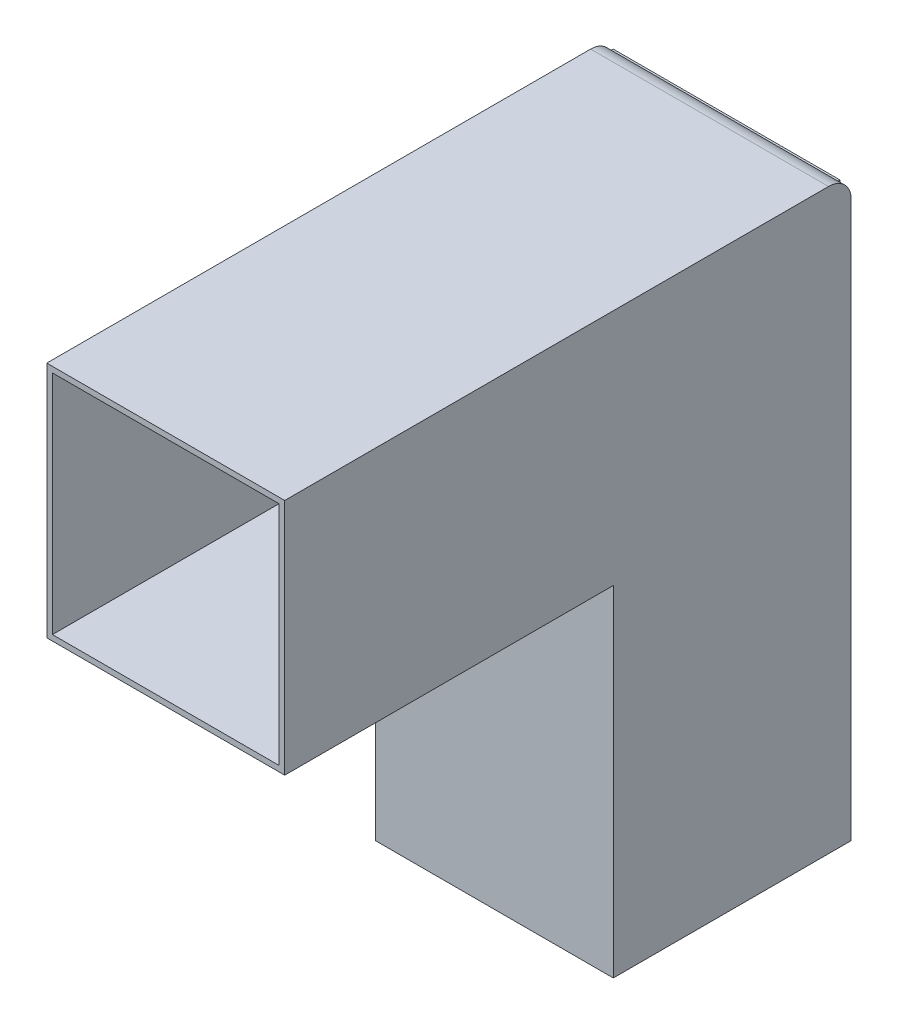
ISO-10303-21;
HEADER;
FILE_DESCRIPTION(('STEP AP214'),'2;1');
FILE_NAME('part.step','',(''),(''),'','','');
FILE_SCHEMA(('AUTOMOTIVE_DESIGN { 1 0 10303 214 1 1 1 1 }'));
ENDSEC;
DATA;
#1=APPLICATION_CONTEXT('core data for automotive mechanical design processes');
#2=APPLICATION_PROTOCOL_DEFINITION('international standard','automotive_design',2000,#1);
#3=PRODUCT_CONTEXT('',#1,'mechanical');
#4=PRODUCT('Part','Part','',(#3));
#5=PRODUCT_RELATED_PRODUCT_CATEGORY('part','',(#4));
#6=PRODUCT_DEFINITION_FORMATION('','',#4);
#7=PRODUCT_DEFINITION_CONTEXT('part definition',#1,'design');
#8=PRODUCT_DEFINITION('design','',#6,#7);
#9=PRODUCT_DEFINITION_SHAPE('','',#8);
#10=(LENGTH_UNIT() NAMED_UNIT(*) SI_UNIT(.MILLI.,.METRE.));
#11=(NAMED_UNIT(*) PLANE_ANGLE_UNIT() SI_UNIT($,.RADIAN.));
#12=(NAMED_UNIT(*) SI_UNIT($,.STERADIAN.) SOLID_ANGLE_UNIT());
#13=UNCERTAINTY_MEASURE_WITH_UNIT(LENGTH_MEASURE(1.E-05),#10,'distance_accuracy_value','');
#14=(GEOMETRIC_REPRESENTATION_CONTEXT(3) GLOBAL_UNCERTAINTY_ASSIGNED_CONTEXT((#13)) GLOBAL_UNIT_ASSIGNED_CONTEXT((#10,
#11,#12)) REPRESENTATION_CONTEXT('',''));
#15=CARTESIAN_POINT('',(0.,0.,0.));
#16=DIRECTION('',(0.,0.,1.));
#17=DIRECTION('',(1.,0.,0.));
#18=AXIS2_PLACEMENT_3D('',#15,#16,#17);
#19=CARTESIAN_POINT('',(-10.5,-10.5,50.));
#20=DIRECTION('',(0.,1.,0.));
#21=DIRECTION('',(0.,0.,1.));
#22=AXIS2_PLACEMENT_3D('',#19,#20,#21);
#23=PLANE('',#22);
#24=DIRECTION('',(-1.,0.,0.));
#25=VECTOR('',#24,1.);
#26=CARTESIAN_POINT('',(-10.5,-10.5,21.));
#27=LINE('',#26,#25);
#28=CARTESIAN_POINT('',(10.5,-10.5,21.));
#29=VERTEX_POINT('',#28);
#30=CARTESIAN_POINT('',(-10.5,-10.5,21.));
#31=VERTEX_POINT('',#30);
#32=EDGE_CURVE('E189',#29,#31,#27,.T.);
#33=ORIENTED_EDGE('',*,*,#32,.F.);
#34=DIRECTION('',(0.,0.,-1.));
#35=VECTOR('',#34,1.);
#36=CARTESIAN_POINT('',(10.5,-10.5,50.));
#37=LINE('',#36,#35);
#38=CARTESIAN_POINT('',(10.5,-10.5,50.));
#39=VERTEX_POINT('',#38);
#40=EDGE_CURVE('E215',#39,#29,#37,.T.);
#41=ORIENTED_EDGE('',*,*,#40,.F.);
#42=DIRECTION('',(1.,0.,0.));
#43=VECTOR('',#42,1.);
#44=CARTESIAN_POINT('',(-10.5,-10.5,50.));
#45=LINE('',#44,#43);
#46=CARTESIAN_POINT('',(-10.5,-10.5,50.));
#47=VERTEX_POINT('',#46);
#48=EDGE_CURVE('E213',#47,#39,#45,.T.);
#49=ORIENTED_EDGE('',*,*,#48,.F.);
#50=DIRECTION('',(0.,0.,-1.));
#51=VECTOR('',#50,1.);
#52=CARTESIAN_POINT('',(-10.5,-10.5,50.));
#53=LINE('',#52,#51);
#54=EDGE_CURVE('E220',#47,#31,#53,.T.);
#55=ORIENTED_EDGE('',*,*,#54,.T.);
#56=EDGE_LOOP('',(#33,#41,#49,#55));
#57=FACE_BOUND('',#56,.T.);
#58=ADVANCED_FACE('F37',(#57),#23,.F.);
#59=CARTESIAN_POINT('',(10.5,10.5,50.));
#60=DIRECTION('',(-1.,0.,0.));
#61=DIRECTION('',(0.,-1.,0.));
#62=AXIS2_PLACEMENT_3D('',#59,#60,#61);
#63=PLANE('',#62);
#64=DIRECTION('',(0.,1.,0.));
#65=VECTOR('',#64,1.);
#66=CARTESIAN_POINT('',(10.5,10.5,0.));
#67=LINE('',#66,#65);
#68=CARTESIAN_POINT('',(10.5,-40.5,0.));
#69=VERTEX_POINT('',#68);
#70=CARTESIAN_POINT('',(10.5,8.5,0.));
#71=VERTEX_POINT('',#70);
#72=EDGE_CURVE('E204',#69,#71,#67,.T.);
#73=ORIENTED_EDGE('',*,*,#72,.T.);
#74=CARTESIAN_POINT('',(10.5,8.5,2.));
#75=DIRECTION('',(-1.,0.,0.));
#76=DIRECTION('',(0.,-1.,0.));
#77=AXIS2_PLACEMENT_3D('',#74,#75,#76);
#78=CIRCLE('',#77,2.);
#79=CARTESIAN_POINT('',(10.5,10.5,2.));
#80=VERTEX_POINT('',#79);
#81=EDGE_CURVE('E11',#71,#80,#78,.F.);
#82=ORIENTED_EDGE('',*,*,#81,.T.);
#83=DIRECTION('',(0.,0.,-1.));
#84=VECTOR('',#83,1.);
#85=CARTESIAN_POINT('',(10.5,10.5,50.));
#86=LINE('',#85,#84);
#87=CARTESIAN_POINT('',(10.5,10.5,50.));
#88=VERTEX_POINT('',#87);
#89=EDGE_CURVE('E224',#88,#80,#86,.T.);
#90=ORIENTED_EDGE('',*,*,#89,.F.);
#91=DIRECTION('',(0.,1.,0.));
#92=VECTOR('',#91,1.);
#93=CARTESIAN_POINT('',(10.5,10.5,50.));
#94=LINE('',#93,#92);
#95=EDGE_CURVE('E205',#39,#88,#94,.T.);
#96=ORIENTED_EDGE('',*,*,#95,.F.);
#97=ORIENTED_EDGE('',*,*,#40,.T.);
#98=DIRECTION('',(0.,1.,0.));
#99=VECTOR('',#98,1.);
#100=CARTESIAN_POINT('',(10.5,-40.5,21.));
#101=LINE('',#100,#99);
#102=CARTESIAN_POINT('',(10.5,-40.5,21.));
#103=VERTEX_POINT('',#102);
#104=EDGE_CURVE('E201',#103,#29,#101,.T.);
#105=ORIENTED_EDGE('',*,*,#104,.F.);
#106=DIRECTION('',(0.,0.,1.));
#107=VECTOR('',#106,1.);
#108=CARTESIAN_POINT('',(10.5,-40.5,0.));
#109=LINE('',#108,#107);
#110=EDGE_CURVE('E192',#69,#103,#109,.T.);
#111=ORIENTED_EDGE('',*,*,#110,.F.);
#112=EDGE_LOOP('',(#73,#82,#90,#96,#97,#105,#111));
#113=FACE_BOUND('',#112,.T.);
#114=ADVANCED_FACE('F246',(#113),#63,.F.);
#115=CARTESIAN_POINT('',(-10.5,10.5,50.));
#116=DIRECTION('',(0.,-1.,0.));
#117=DIRECTION('',(0.,0.,-1.));
#118=AXIS2_PLACEMENT_3D('',#115,#116,#117);
#119=PLANE('',#118);
#120=ORIENTED_EDGE('',*,*,#89,.T.);
#121=DIRECTION('',(-1.,0.,0.));
#122=VECTOR('',#121,1.);
#123=CARTESIAN_POINT('',(-10.5,10.5,2.));
#124=LINE('',#123,#122);
#125=CARTESIAN_POINT('',(-10.5,10.5,2.));
#126=VERTEX_POINT('',#125);
#127=EDGE_CURVE('E227',#80,#126,#124,.T.);
#128=ORIENTED_EDGE('',*,*,#127,.T.);
#129=DIRECTION('',(0.,0.,-1.));
#130=VECTOR('',#129,1.);
#131=CARTESIAN_POINT('',(-10.5,10.5,50.));
#132=LINE('',#131,#130);
#133=CARTESIAN_POINT('',(-10.5,10.5,50.));
#134=VERTEX_POINT('',#133);
#135=EDGE_CURVE('E222',#134,#126,#132,.T.);
#136=ORIENTED_EDGE('',*,*,#135,.F.);
#137=DIRECTION('',(-1.,0.,0.));
#138=VECTOR('',#137,1.);
#139=CARTESIAN_POINT('',(-10.5,10.5,50.));
#140=LINE('',#139,#138);
#141=EDGE_CURVE('E208',#88,#134,#140,.T.);
#142=ORIENTED_EDGE('',*,*,#141,.F.);
#143=EDGE_LOOP('',(#120,#128,#136,#142));
#144=FACE_BOUND('',#143,.T.);
#145=ADVANCED_FACE('F233',(#144),#119,.F.);
#146=CARTESIAN_POINT('',(-10.5,10.5,50.));
#147=DIRECTION('',(1.,0.,0.));
#148=DIRECTION('',(0.,1.,0.));
#149=AXIS2_PLACEMENT_3D('',#146,#147,#148);
#150=PLANE('',#149);
#151=ORIENTED_EDGE('',*,*,#135,.T.);
#152=CARTESIAN_POINT('',(-10.5,8.5,2.));
#153=DIRECTION('',(1.,0.,0.));
#154=DIRECTION('',(0.,1.,0.));
#155=AXIS2_PLACEMENT_3D('',#152,#153,#154);
#156=CIRCLE('',#155,2.);
#157=CARTESIAN_POINT('',(-10.5,8.5,0.));
#158=VERTEX_POINT('',#157);
#159=EDGE_CURVE('E59',#126,#158,#156,.F.);
#160=ORIENTED_EDGE('',*,*,#159,.T.);
#161=DIRECTION('',(0.,-1.,0.));
#162=VECTOR('',#161,1.);
#163=CARTESIAN_POINT('',(-10.5,10.5,0.));
#164=LINE('',#163,#162);
#165=CARTESIAN_POINT('',(-10.5,-40.5,0.));
#166=VERTEX_POINT('',#165);
#167=EDGE_CURVE('E209',#158,#166,#164,.T.);
#168=ORIENTED_EDGE('',*,*,#167,.T.);
#169=DIRECTION('',(0.,0.,-1.));
#170=VECTOR('',#169,1.);
#171=CARTESIAN_POINT('',(-10.5,-40.5,21.));
#172=LINE('',#171,#170);
#173=CARTESIAN_POINT('',(-10.5,-40.5,21.));
#174=VERTEX_POINT('',#173);
#175=EDGE_CURVE('E185',#174,#166,#172,.T.);
#176=ORIENTED_EDGE('',*,*,#175,.F.);
#177=DIRECTION('',(0.,1.,0.));
#178=VECTOR('',#177,1.);
#179=CARTESIAN_POINT('',(-10.5,-40.5,21.));
#180=LINE('',#179,#178);
#181=EDGE_CURVE('E196',#174,#31,#180,.T.);
#182=ORIENTED_EDGE('',*,*,#181,.T.);
#183=ORIENTED_EDGE('',*,*,#54,.F.);
#184=DIRECTION('',(0.,-1.,0.));
#185=VECTOR('',#184,1.);
#186=CARTESIAN_POINT('',(-10.5,10.5,50.));
#187=LINE('',#186,#185);
#188=EDGE_CURVE('E211',#134,#47,#187,.T.);
#189=ORIENTED_EDGE('',*,*,#188,.F.);
#190=EDGE_LOOP('',(#151,#160,#168,#176,#182,#183,#189));
#191=FACE_BOUND('',#190,.T.);
#192=ADVANCED_FACE('F238',(#191),#150,.F.);
#193=CARTESIAN_POINT('',(0.,0.,50.));
#194=DIRECTION('',(0.,0.,1.));
#195=DIRECTION('',(1.,0.,0.));
#196=AXIS2_PLACEMENT_3D('',#193,#194,#195);
#197=PLANE('',#196);
#198=DIRECTION('',(0.,1.,0.));
#199=VECTOR('',#198,1.);
#200=CARTESIAN_POINT('',(10.,10.5,50.));
#201=LINE('',#200,#199);
#202=CARTESIAN_POINT('',(10.,-10.,50.));
#203=VERTEX_POINT('',#202);
#204=CARTESIAN_POINT('',(10.,10.,50.));
#205=VERTEX_POINT('',#204);
#206=EDGE_CURVE('E169',#203,#205,#201,.T.);
#207=ORIENTED_EDGE('',*,*,#206,.F.);
#208=DIRECTION('',(1.,0.,0.));
#209=VECTOR('',#208,1.);
#210=CARTESIAN_POINT('',(-10.5,-10.,50.));
#211=LINE('',#210,#209);
#212=CARTESIAN_POINT('',(-10.,-10.,50.));
#213=VERTEX_POINT('',#212);
#214=EDGE_CURVE('E145',#213,#203,#211,.T.);
#215=ORIENTED_EDGE('',*,*,#214,.F.);
#216=DIRECTION('',(0.,-1.,0.));
#217=VECTOR('',#216,1.);
#218=CARTESIAN_POINT('',(-10.,10.5,50.));
#219=LINE('',#218,#217);
#220=CARTESIAN_POINT('',(-10.,10.,50.));
#221=VERTEX_POINT('',#220);
#222=EDGE_CURVE('E172',#221,#213,#219,.T.);
#223=ORIENTED_EDGE('',*,*,#222,.F.);
#224=DIRECTION('',(-1.,0.,0.));
#225=VECTOR('',#224,1.);
#226=CARTESIAN_POINT('',(-10.5,10.,50.));
#227=LINE('',#226,#225);
#228=EDGE_CURVE('E174',#205,#221,#227,.T.);
#229=ORIENTED_EDGE('',*,*,#228,.F.);
#230=EDGE_LOOP('',(#207,#215,#223,#229));
#231=FACE_BOUND('',#230,.T.);
#232=ORIENTED_EDGE('',*,*,#95,.T.);
#233=ORIENTED_EDGE('',*,*,#141,.T.);
#234=ORIENTED_EDGE('',*,*,#188,.T.);
#235=ORIENTED_EDGE('',*,*,#48,.T.);
#236=EDGE_LOOP('',(#232,#233,#234,#235));
#237=FACE_BOUND('',#236,.T.);
#238=ADVANCED_FACE('F242',(#231,#237),#197,.T.);
#239=CARTESIAN_POINT('',(0.,0.,0.));
#240=DIRECTION('',(0.,0.,1.));
#241=DIRECTION('',(1.,0.,0.));
#242=AXIS2_PLACEMENT_3D('',#239,#240,#241);
#243=PLANE('',#242);
#244=ORIENTED_EDGE('',*,*,#167,.F.);
#245=DIRECTION('',(-1.,0.,0.));
#246=VECTOR('',#245,1.);
#247=CARTESIAN_POINT('',(0.,8.5,0.));
#248=LINE('',#247,#246);
#249=EDGE_CURVE('E45',#158,#71,#248,.F.);
#250=ORIENTED_EDGE('',*,*,#249,.T.);
#251=ORIENTED_EDGE('',*,*,#72,.F.);
#252=DIRECTION('',(1.,0.,0.));
#253=VECTOR('',#252,1.);
#254=CARTESIAN_POINT('',(-10.5,-40.5,0.));
#255=LINE('',#254,#253);
#256=EDGE_CURVE('E188',#166,#69,#255,.T.);
#257=ORIENTED_EDGE('',*,*,#256,.F.);
#258=EDGE_LOOP('',(#244,#250,#251,#257));
#259=FACE_BOUND('',#258,.T.);
#260=ADVANCED_FACE('F262',(#259),#243,.F.);
#261=CARTESIAN_POINT('',(-10.5,-40.5,21.));
#262=DIRECTION('',(0.,0.,-1.));
#263=DIRECTION('',(-1.,0.,0.));
#264=AXIS2_PLACEMENT_3D('',#261,#262,#263);
#265=PLANE('',#264);
#266=ORIENTED_EDGE('',*,*,#32,.T.);
#267=ORIENTED_EDGE('',*,*,#181,.F.);
#268=DIRECTION('',(-1.,0.,0.));
#269=VECTOR('',#268,1.);
#270=CARTESIAN_POINT('',(-10.5,-40.5,21.));
#271=LINE('',#270,#269);
#272=EDGE_CURVE('E194',#103,#174,#271,.T.);
#273=ORIENTED_EDGE('',*,*,#272,.F.);
#274=ORIENTED_EDGE('',*,*,#104,.T.);
#275=EDGE_LOOP('',(#266,#267,#273,#274));
#276=FACE_BOUND('',#275,.T.);
#277=ADVANCED_FACE('F289',(#276),#265,.F.);
#278=CARTESIAN_POINT('',(0.,-40.5,0.));
#279=DIRECTION('',(0.,-1.,0.));
#280=DIRECTION('',(0.,0.,-1.));
#281=AXIS2_PLACEMENT_3D('',#278,#279,#280);
#282=PLANE('',#281);
#283=DIRECTION('',(0.,0.,-1.));
#284=VECTOR('',#283,1.);
#285=CARTESIAN_POINT('',(-9.99999999999999,-40.5,50.));
#286=LINE('',#285,#284);
#287=CARTESIAN_POINT('',(-9.99999999999999,-40.5,20.5));
#288=VERTEX_POINT('',#287);
#289=CARTESIAN_POINT('',(-9.99999999999999,-40.5,0.5));
#290=VERTEX_POINT('',#289);
#291=EDGE_CURVE('E139',#288,#290,#286,.T.);
#292=ORIENTED_EDGE('',*,*,#291,.F.);
#293=DIRECTION('',(-1.,0.,0.));
#294=VECTOR('',#293,1.);
#295=CARTESIAN_POINT('',(-10.5,-40.5,20.5));
#296=LINE('',#295,#294);
#297=CARTESIAN_POINT('',(10.,-40.5,20.5));
#298=VERTEX_POINT('',#297);
#299=EDGE_CURVE('E159',#298,#288,#296,.T.);
#300=ORIENTED_EDGE('',*,*,#299,.F.);
#301=DIRECTION('',(0.,0.,1.));
#302=VECTOR('',#301,1.);
#303=CARTESIAN_POINT('',(10.,-40.5,50.));
#304=LINE('',#303,#302);
#305=CARTESIAN_POINT('',(10.,-40.5,0.5));
#306=VERTEX_POINT('',#305);
#307=EDGE_CURVE('E152',#306,#298,#304,.T.);
#308=ORIENTED_EDGE('',*,*,#307,.F.);
#309=DIRECTION('',(1.,0.,0.));
#310=VECTOR('',#309,1.);
#311=CARTESIAN_POINT('',(0.,-40.5,0.5));
#312=LINE('',#311,#310);
#313=EDGE_CURVE('E179',#290,#306,#312,.T.);
#314=ORIENTED_EDGE('',*,*,#313,.F.);
#315=EDGE_LOOP('',(#292,#300,#308,#314));
#316=FACE_BOUND('',#315,.T.);
#317=ORIENTED_EDGE('',*,*,#175,.T.);
#318=ORIENTED_EDGE('',*,*,#256,.T.);
#319=ORIENTED_EDGE('',*,*,#110,.T.);
#320=ORIENTED_EDGE('',*,*,#272,.T.);
#321=EDGE_LOOP('',(#317,#318,#319,#320));
#322=FACE_BOUND('',#321,.T.);
#323=ADVANCED_FACE('F294',(#316,#322),#282,.T.);
#324=CARTESIAN_POINT('',(-10.5,-10.,50.));
#325=DIRECTION('',(0.,1.,0.));
#326=DIRECTION('',(0.,0.,1.));
#327=AXIS2_PLACEMENT_3D('',#324,#325,#326);
#328=PLANE('',#327);
#329=DIRECTION('',(-1.,0.,0.));
#330=VECTOR('',#329,1.);
#331=CARTESIAN_POINT('',(-10.5,-10.,20.5));
#332=LINE('',#331,#330);
#333=CARTESIAN_POINT('',(10.,-10.,20.5));
#334=VERTEX_POINT('',#333);
#335=CARTESIAN_POINT('',(-10.,-10.,20.5));
#336=VERTEX_POINT('',#335);
#337=EDGE_CURVE('E130',#334,#336,#332,.T.);
#338=ORIENTED_EDGE('',*,*,#337,.T.);
#339=DIRECTION('',(0.,0.,-1.));
#340=VECTOR('',#339,1.);
#341=CARTESIAN_POINT('',(-10.,-10.,50.));
#342=LINE('',#341,#340);
#343=EDGE_CURVE('E148',#213,#336,#342,.T.);
#344=ORIENTED_EDGE('',*,*,#343,.F.);
#345=ORIENTED_EDGE('',*,*,#214,.T.);
#346=DIRECTION('',(0.,0.,-1.));
#347=VECTOR('',#346,1.);
#348=CARTESIAN_POINT('',(10.,-10.,50.));
#349=LINE('',#348,#347);
#350=EDGE_CURVE('E142',#203,#334,#349,.T.);
#351=ORIENTED_EDGE('',*,*,#350,.T.);
#352=EDGE_LOOP('',(#338,#344,#345,#351));
#353=FACE_BOUND('',#352,.T.);
#354=ADVANCED_FACE('F143',(#353),#328,.T.);
#355=CARTESIAN_POINT('',(10.,10.5,50.));
#356=DIRECTION('',(-1.,0.,0.));
#357=DIRECTION('',(0.,-1.,0.));
#358=AXIS2_PLACEMENT_3D('',#355,#356,#357);
#359=PLANE('',#358);
#360=DIRECTION('',(0.,1.,0.));
#361=VECTOR('',#360,1.);
#362=CARTESIAN_POINT('',(10.,10.5,0.5));
#363=LINE('',#362,#361);
#364=CARTESIAN_POINT('',(10.,10.,0.5));
#365=VERTEX_POINT('',#364);
#366=EDGE_CURVE('E154',#306,#365,#363,.T.);
#367=ORIENTED_EDGE('',*,*,#366,.F.);
#368=ORIENTED_EDGE('',*,*,#307,.T.);
#369=DIRECTION('',(0.,1.,0.));
#370=VECTOR('',#369,1.);
#371=CARTESIAN_POINT('',(10.,-40.5,20.5));
#372=LINE('',#371,#370);
#373=EDGE_CURVE('E134',#298,#334,#372,.T.);
#374=ORIENTED_EDGE('',*,*,#373,.T.);
#375=ORIENTED_EDGE('',*,*,#350,.F.);
#376=ORIENTED_EDGE('',*,*,#206,.T.);
#377=DIRECTION('',(0.,0.,-1.));
#378=VECTOR('',#377,1.);
#379=CARTESIAN_POINT('',(9.99999999999999,10.,50.));
#380=LINE('',#379,#378);
#381=EDGE_CURVE('E163',#205,#365,#380,.T.);
#382=ORIENTED_EDGE('',*,*,#381,.T.);
#383=EDGE_LOOP('',(#367,#368,#374,#375,#376,#382));
#384=FACE_BOUND('',#383,.T.);
#385=ADVANCED_FACE('F150',(#384),#359,.T.);
#386=CARTESIAN_POINT('',(-10.5,10.,50.));
#387=DIRECTION('',(0.,-1.,0.));
#388=DIRECTION('',(0.,0.,-1.));
#389=AXIS2_PLACEMENT_3D('',#386,#387,#388);
#390=PLANE('',#389);
#391=DIRECTION('',(-1.,0.,0.));
#392=VECTOR('',#391,1.);
#393=CARTESIAN_POINT('',(-10.5,10.,0.5));
#394=LINE('',#393,#392);
#395=CARTESIAN_POINT('',(-10.,10.,0.5));
#396=VERTEX_POINT('',#395);
#397=EDGE_CURVE('E157',#365,#396,#394,.T.);
#398=ORIENTED_EDGE('',*,*,#397,.F.);
#399=ORIENTED_EDGE('',*,*,#381,.F.);
#400=ORIENTED_EDGE('',*,*,#228,.T.);
#401=DIRECTION('',(0.,0.,-1.));
#402=VECTOR('',#401,1.);
#403=CARTESIAN_POINT('',(-10.,10.,50.));
#404=LINE('',#403,#402);
#405=EDGE_CURVE('E166',#221,#396,#404,.T.);
#406=ORIENTED_EDGE('',*,*,#405,.T.);
#407=EDGE_LOOP('',(#398,#399,#400,#406));
#408=FACE_BOUND('',#407,.T.);
#409=ADVANCED_FACE('F314',(#408),#390,.T.);
#410=CARTESIAN_POINT('',(-10.,10.5,50.));
#411=DIRECTION('',(1.,0.,0.));
#412=DIRECTION('',(0.,1.,0.));
#413=AXIS2_PLACEMENT_3D('',#410,#411,#412);
#414=PLANE('',#413);
#415=DIRECTION('',(0.,-1.,0.));
#416=VECTOR('',#415,1.);
#417=CARTESIAN_POINT('',(-10.,10.5,0.5));
#418=LINE('',#417,#416);
#419=EDGE_CURVE('E165',#396,#290,#418,.T.);
#420=ORIENTED_EDGE('',*,*,#419,.F.);
#421=ORIENTED_EDGE('',*,*,#405,.F.);
#422=ORIENTED_EDGE('',*,*,#222,.T.);
#423=ORIENTED_EDGE('',*,*,#343,.T.);
#424=DIRECTION('',(0.,1.,0.));
#425=VECTOR('',#424,1.);
#426=CARTESIAN_POINT('',(-10.,10.5,20.5));
#427=LINE('',#426,#425);
#428=EDGE_CURVE('E137',#288,#336,#427,.T.);
#429=ORIENTED_EDGE('',*,*,#428,.F.);
#430=ORIENTED_EDGE('',*,*,#291,.T.);
#431=EDGE_LOOP('',(#420,#421,#422,#423,#429,#430));
#432=FACE_BOUND('',#431,.T.);
#433=ADVANCED_FACE('F321',(#432),#414,.T.);
#434=CARTESIAN_POINT('',(0.,0.,0.5));
#435=DIRECTION('',(0.,0.,1.));
#436=DIRECTION('',(1.,0.,0.));
#437=AXIS2_PLACEMENT_3D('',#434,#435,#436);
#438=PLANE('',#437);
#439=ORIENTED_EDGE('',*,*,#366,.T.);
#440=ORIENTED_EDGE('',*,*,#397,.T.);
#441=ORIENTED_EDGE('',*,*,#419,.T.);
#442=ORIENTED_EDGE('',*,*,#313,.T.);
#443=EDGE_LOOP('',(#439,#440,#441,#442));
#444=FACE_BOUND('',#443,.T.);
#445=ADVANCED_FACE('F252',(#444),#438,.T.);
#446=CARTESIAN_POINT('',(-10.5,-40.5,20.5));
#447=DIRECTION('',(0.,0.,-1.));
#448=DIRECTION('',(-1.,0.,0.));
#449=AXIS2_PLACEMENT_3D('',#446,#447,#448);
#450=PLANE('',#449);
#451=ORIENTED_EDGE('',*,*,#337,.F.);
#452=ORIENTED_EDGE('',*,*,#373,.F.);
#453=ORIENTED_EDGE('',*,*,#299,.T.);
#454=ORIENTED_EDGE('',*,*,#428,.T.);
#455=EDGE_LOOP('',(#451,#452,#453,#454));
#456=FACE_BOUND('',#455,.T.);
#457=ADVANCED_FACE('F132',(#456),#450,.T.);
#458=CARTESIAN_POINT('',(-10.5,8.5,2.));
#459=DIRECTION('',(-1.,0.,0.));
#460=DIRECTION('',(0.,0.,1.));
#461=AXIS2_PLACEMENT_3D('',#458,#459,#460);
#462=CYLINDRICAL_SURFACE('',#461,2.);
#463=ORIENTED_EDGE('',*,*,#81,.F.);
#464=ORIENTED_EDGE('',*,*,#249,.F.);
#465=ORIENTED_EDGE('',*,*,#159,.F.);
#466=ORIENTED_EDGE('',*,*,#127,.F.);
#467=EDGE_LOOP('',(#463,#464,#465,#466));
#468=FACE_BOUND('',#467,.T.);
#469=ADVANCED_FACE('F39',(#468),#462,.T.);
#470=CLOSED_SHELL('',(#58,#114,#145,#192,#238,#260,#277,#323,#354,#385,#409,#433,#445,#457,#469));
#471=MANIFOLD_SOLID_BREP('B2',#470);
#472=ADVANCED_BREP_SHAPE_REPRESENTATION('',(#18,#471),#14);
#473=SHAPE_DEFINITION_REPRESENTATION(#9,#472);
ENDSEC;
END-ISO-10303-21;
